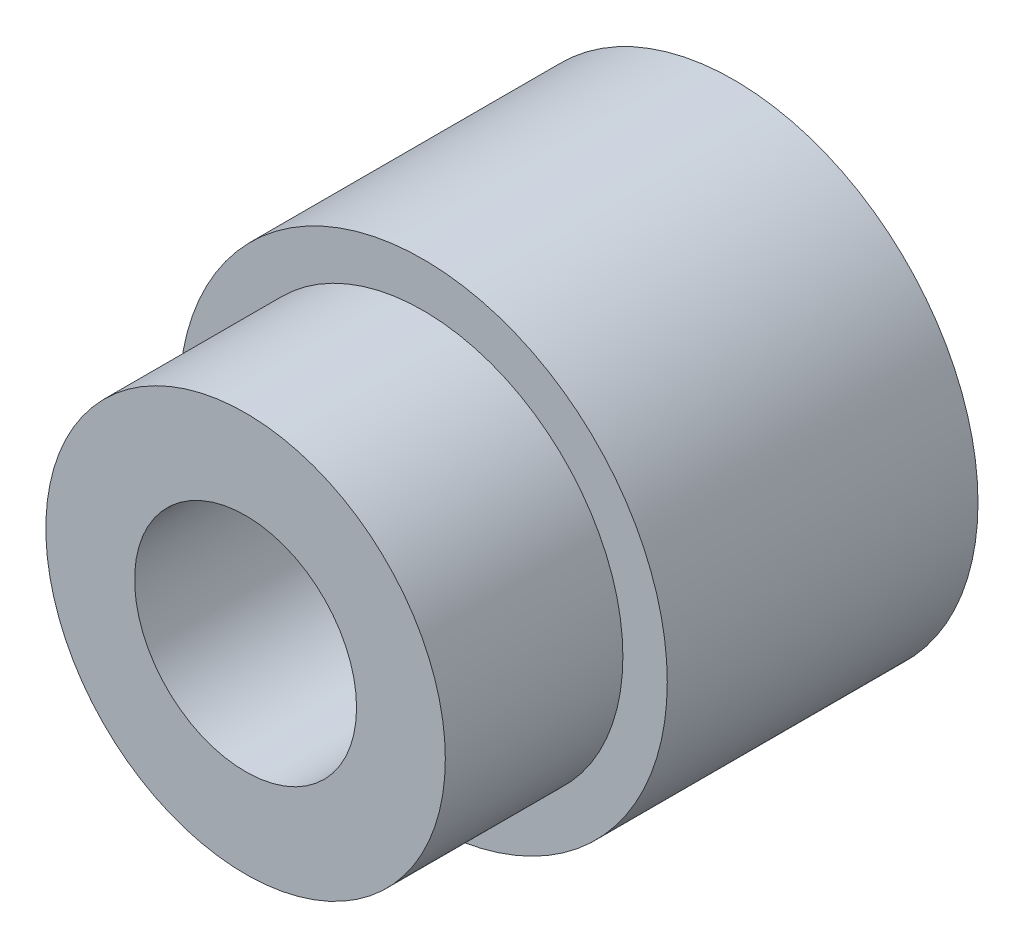
ISO-10303-21;
HEADER;
FILE_DESCRIPTION(('STEP AP214'),'2;1');
FILE_NAME('part.step','',(''),(''),'','','');
FILE_SCHEMA(('AUTOMOTIVE_DESIGN { 1 0 10303 214 1 1 1 1 }'));
ENDSEC;
DATA;
#1=APPLICATION_CONTEXT('core data for automotive mechanical design processes');
#2=APPLICATION_PROTOCOL_DEFINITION('international standard','automotive_design',2000,#1);
#3=PRODUCT_CONTEXT('',#1,'mechanical');
#4=PRODUCT('Part','Part','',(#3));
#5=PRODUCT_RELATED_PRODUCT_CATEGORY('part','',(#4));
#6=PRODUCT_DEFINITION_FORMATION('','',#4);
#7=PRODUCT_DEFINITION_CONTEXT('part definition',#1,'design');
#8=PRODUCT_DEFINITION('design','',#6,#7);
#9=PRODUCT_DEFINITION_SHAPE('','',#8);
#10=(LENGTH_UNIT() NAMED_UNIT(*) SI_UNIT(.MILLI.,.METRE.));
#11=(NAMED_UNIT(*) PLANE_ANGLE_UNIT() SI_UNIT($,.RADIAN.));
#12=(NAMED_UNIT(*) SI_UNIT($,.STERADIAN.) SOLID_ANGLE_UNIT());
#13=UNCERTAINTY_MEASURE_WITH_UNIT(LENGTH_MEASURE(1.E-05),#10,'distance_accuracy_value','');
#14=(GEOMETRIC_REPRESENTATION_CONTEXT(3) GLOBAL_UNCERTAINTY_ASSIGNED_CONTEXT((#13)) GLOBAL_UNIT_ASSIGNED_CONTEXT((#10,
#11,#12)) REPRESENTATION_CONTEXT('',''));
#15=CARTESIAN_POINT('',(0.,0.,0.));
#16=DIRECTION('',(0.,0.,1.));
#17=DIRECTION('',(1.,0.,0.));
#18=AXIS2_PLACEMENT_3D('',#15,#16,#17);
#19=CARTESIAN_POINT('',(0.,0.,7.));
#20=DIRECTION('',(0.,0.,-1.));
#21=DIRECTION('',(-1.,0.,0.));
#22=AXIS2_PLACEMENT_3D('',#19,#20,#21);
#23=CYLINDRICAL_SURFACE('',#22,5.5);
#24=CARTESIAN_POINT('',(0.,0.,7.));
#25=DIRECTION('',(0.,0.,1.));
#26=DIRECTION('',(1.,0.,0.));
#27=AXIS2_PLACEMENT_3D('',#24,#25,#26);
#28=CIRCLE('',#27,5.5);
#29=CARTESIAN_POINT('',(5.5,0.,7.));
#30=VERTEX_POINT('',#29);
#31=EDGE_CURVE('E10',#30,#30,#28,.T.);
#32=ORIENTED_EDGE('',*,*,#31,.F.);
#33=EDGE_LOOP('',(#32));
#34=FACE_BOUND('',#33,.T.);
#35=CARTESIAN_POINT('',(0.,0.,0.));
#36=DIRECTION('',(0.,0.,1.));
#37=DIRECTION('',(1.,0.,0.));
#38=AXIS2_PLACEMENT_3D('',#35,#36,#37);
#39=CIRCLE('',#38,5.5);
#40=CARTESIAN_POINT('',(5.5,0.,0.));
#41=VERTEX_POINT('',#40);
#42=EDGE_CURVE('E34',#41,#41,#39,.T.);
#43=ORIENTED_EDGE('',*,*,#42,.T.);
#44=EDGE_LOOP('',(#43));
#45=FACE_BOUND('',#44,.T.);
#46=ADVANCED_FACE('F31',(#34,#45),#23,.T.);
#47=CARTESIAN_POINT('',(0.,0.,7.));
#48=DIRECTION('',(0.,0.,1.));
#49=DIRECTION('',(1.,0.,0.));
#50=AXIS2_PLACEMENT_3D('',#47,#48,#49);
#51=PLANE('',#50);
#52=CARTESIAN_POINT('',(0.,0.,7.));
#53=DIRECTION('',(0.,0.,1.));
#54=DIRECTION('',(1.,0.,0.));
#55=AXIS2_PLACEMENT_3D('',#52,#53,#54);
#56=CIRCLE('',#55,4.5);
#57=CARTESIAN_POINT('',(4.5,0.,7.));
#58=VERTEX_POINT('',#57);
#59=EDGE_CURVE('E43',#58,#58,#56,.T.);
#60=ORIENTED_EDGE('',*,*,#59,.F.);
#61=EDGE_LOOP('',(#60));
#62=FACE_BOUND('',#61,.T.);
#63=ORIENTED_EDGE('',*,*,#31,.T.);
#64=EDGE_LOOP('',(#63));
#65=FACE_BOUND('',#64,.T.);
#66=ADVANCED_FACE('F71',(#62,#65),#51,.T.);
#67=CARTESIAN_POINT('',(0.,0.,0.));
#68=DIRECTION('',(0.,0.,1.));
#69=DIRECTION('',(1.,0.,0.));
#70=AXIS2_PLACEMENT_3D('',#67,#68,#69);
#71=PLANE('',#70);
#72=CARTESIAN_POINT('',(0.,0.,0.));
#73=DIRECTION('',(0.,0.,1.));
#74=DIRECTION('',(1.,0.,0.));
#75=AXIS2_PLACEMENT_3D('',#72,#73,#74);
#76=CIRCLE('',#75,2.5);
#77=CARTESIAN_POINT('',(2.5,0.,0.));
#78=VERTEX_POINT('',#77);
#79=EDGE_CURVE('E46',#78,#78,#76,.F.);
#80=ORIENTED_EDGE('',*,*,#79,.F.);
#81=EDGE_LOOP('',(#80));
#82=FACE_BOUND('',#81,.T.);
#83=ORIENTED_EDGE('',*,*,#42,.F.);
#84=EDGE_LOOP('',(#83));
#85=FACE_BOUND('',#84,.T.);
#86=ADVANCED_FACE('F67',(#82,#85),#71,.F.);
#87=CARTESIAN_POINT('',(0.,0.,11.));
#88=DIRECTION('',(0.,0.,-1.));
#89=DIRECTION('',(-1.,0.,0.));
#90=AXIS2_PLACEMENT_3D('',#87,#88,#89);
#91=CYLINDRICAL_SURFACE('',#90,4.5);
#92=CARTESIAN_POINT('',(0.,0.,11.));
#93=DIRECTION('',(0.,0.,1.));
#94=DIRECTION('',(1.,0.,0.));
#95=AXIS2_PLACEMENT_3D('',#92,#93,#94);
#96=CIRCLE('',#95,4.5);
#97=CARTESIAN_POINT('',(4.5,0.,11.));
#98=VERTEX_POINT('',#97);
#99=EDGE_CURVE('E41',#98,#98,#96,.T.);
#100=ORIENTED_EDGE('',*,*,#99,.F.);
#101=EDGE_LOOP('',(#100));
#102=FACE_BOUND('',#101,.T.);
#103=ORIENTED_EDGE('',*,*,#59,.T.);
#104=EDGE_LOOP('',(#103));
#105=FACE_BOUND('',#104,.T.);
#106=ADVANCED_FACE('F61',(#102,#105),#91,.T.);
#107=CARTESIAN_POINT('',(0.,0.,11.));
#108=DIRECTION('',(0.,0.,1.));
#109=DIRECTION('',(1.,0.,0.));
#110=AXIS2_PLACEMENT_3D('',#107,#108,#109);
#111=PLANE('',#110);
#112=CARTESIAN_POINT('',(0.,0.,11.));
#113=DIRECTION('',(0.,0.,1.));
#114=DIRECTION('',(1.,0.,0.));
#115=AXIS2_PLACEMENT_3D('',#112,#113,#114);
#116=CIRCLE('',#115,2.5);
#117=CARTESIAN_POINT('',(2.5,0.,11.));
#118=VERTEX_POINT('',#117);
#119=EDGE_CURVE('E51',#118,#118,#116,.T.);
#120=ORIENTED_EDGE('',*,*,#119,.F.);
#121=EDGE_LOOP('',(#120));
#122=FACE_BOUND('',#121,.T.);
#123=ORIENTED_EDGE('',*,*,#99,.T.);
#124=EDGE_LOOP('',(#123));
#125=FACE_BOUND('',#124,.T.);
#126=ADVANCED_FACE('F58',(#122,#125),#111,.T.);
#127=CARTESIAN_POINT('',(0.,0.,-0.000999999999999265));
#128=DIRECTION('',(0.,0.,1.));
#129=DIRECTION('',(1.,0.,0.));
#130=AXIS2_PLACEMENT_3D('',#127,#128,#129);
#131=CYLINDRICAL_SURFACE('',#130,2.5);
#132=ORIENTED_EDGE('',*,*,#119,.T.);
#133=EDGE_LOOP('',(#132));
#134=FACE_BOUND('',#133,.T.);
#135=ORIENTED_EDGE('',*,*,#79,.T.);
#136=EDGE_LOOP('',(#135));
#137=FACE_BOUND('',#136,.T.);
#138=ADVANCED_FACE('F55',(#134,#137),#131,.F.);
#139=CLOSED_SHELL('',(#46,#66,#86,#106,#126,#138));
#140=MANIFOLD_SOLID_BREP('B2',#139);
#141=ADVANCED_BREP_SHAPE_REPRESENTATION('',(#18,#140),#14);
#142=SHAPE_DEFINITION_REPRESENTATION(#9,#141);
ENDSEC;
END-ISO-10303-21;
